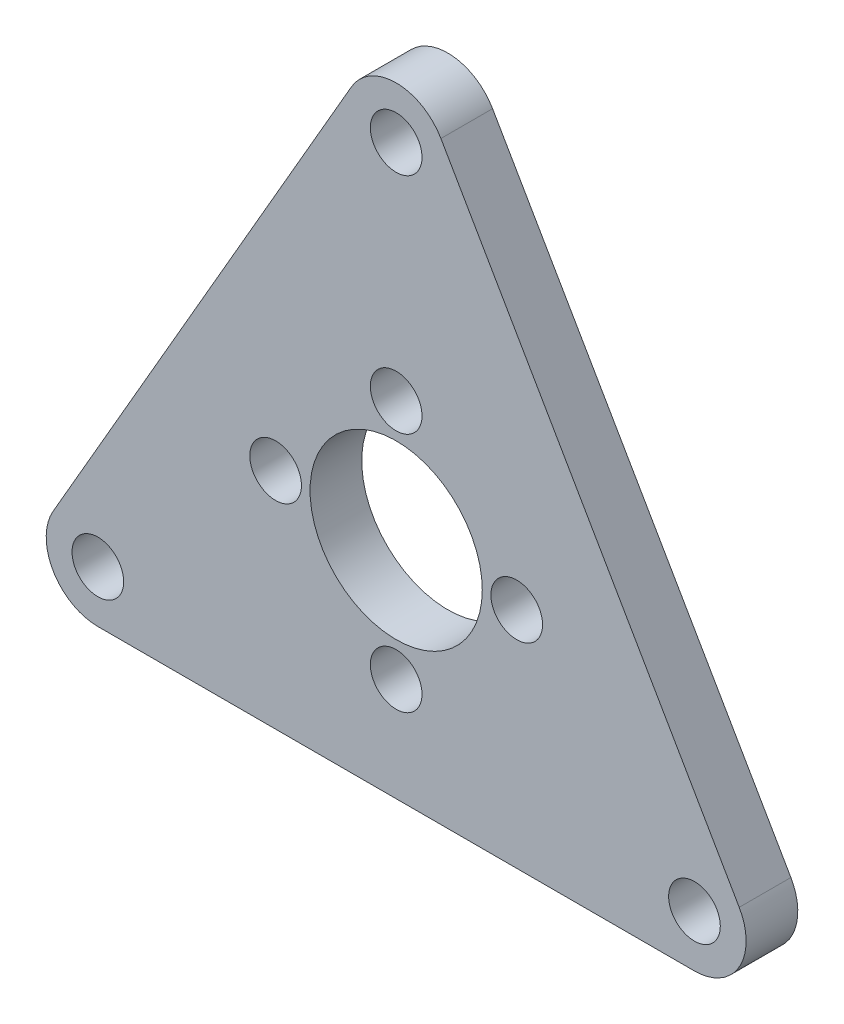
ISO-10303-21;
HEADER;
FILE_DESCRIPTION(('STEP AP214'),'2;1');
FILE_NAME('part.step','',(''),(''),'','','');
FILE_SCHEMA(('AUTOMOTIVE_DESIGN { 1 0 10303 214 1 1 1 1 }'));
ENDSEC;
DATA;
#1=APPLICATION_CONTEXT('core data for automotive mechanical design processes');
#2=APPLICATION_PROTOCOL_DEFINITION('international standard','automotive_design',2000,#1);
#3=PRODUCT_CONTEXT('',#1,'mechanical');
#4=PRODUCT('Part','Part','',(#3));
#5=PRODUCT_RELATED_PRODUCT_CATEGORY('part','',(#4));
#6=PRODUCT_DEFINITION_FORMATION('','',#4);
#7=PRODUCT_DEFINITION_CONTEXT('part definition',#1,'design');
#8=PRODUCT_DEFINITION('design','',#6,#7);
#9=PRODUCT_DEFINITION_SHAPE('','',#8);
#10=(LENGTH_UNIT() NAMED_UNIT(*) SI_UNIT(.MILLI.,.METRE.));
#11=(NAMED_UNIT(*) PLANE_ANGLE_UNIT() SI_UNIT($,.RADIAN.));
#12=(NAMED_UNIT(*) SI_UNIT($,.STERADIAN.) SOLID_ANGLE_UNIT());
#13=UNCERTAINTY_MEASURE_WITH_UNIT(LENGTH_MEASURE(1.E-05),#10,'distance_accuracy_value','');
#14=(GEOMETRIC_REPRESENTATION_CONTEXT(3) GLOBAL_UNCERTAINTY_ASSIGNED_CONTEXT((#13)) GLOBAL_UNIT_ASSIGNED_CONTEXT((#10,
#11,#12)) REPRESENTATION_CONTEXT('',''));
#15=CARTESIAN_POINT('',(0.,0.,0.));
#16=DIRECTION('',(0.,0.,1.));
#17=DIRECTION('',(1.,0.,0.));
#18=AXIS2_PLACEMENT_3D('',#15,#16,#17);
#19=CARTESIAN_POINT('',(-17.3205080756888,-9.99999999999999,3.));
#20=DIRECTION('',(0.,0.,1.));
#21=DIRECTION('',(1.,0.,0.));
#22=AXIS2_PLACEMENT_3D('',#19,#20,#21);
#23=PLANE('',#22);
#24=CARTESIAN_POINT('',(7.,0.,3.));
#25=DIRECTION('',(0.,0.,1.));
#26=DIRECTION('',(1.,0.,0.));
#27=AXIS2_PLACEMENT_3D('',#24,#25,#26);
#28=CIRCLE('',#27,1.5);
#29=CARTESIAN_POINT('',(8.5,0.,3.));
#30=VERTEX_POINT('',#29);
#31=EDGE_CURVE('E217',#30,#30,#28,.F.);
#32=ORIENTED_EDGE('',*,*,#31,.T.);
#33=EDGE_LOOP('',(#32));
#34=FACE_BOUND('',#33,.T.);
#35=CARTESIAN_POINT('',(-7.,0.,3.));
#36=DIRECTION('',(0.,0.,1.));
#37=DIRECTION('',(1.,0.,0.));
#38=AXIS2_PLACEMENT_3D('',#35,#36,#37);
#39=CIRCLE('',#38,1.5);
#40=CARTESIAN_POINT('',(-5.5,0.,3.));
#41=VERTEX_POINT('',#40);
#42=EDGE_CURVE('E222',#41,#41,#39,.F.);
#43=ORIENTED_EDGE('',*,*,#42,.T.);
#44=EDGE_LOOP('',(#43));
#45=FACE_BOUND('',#44,.T.);
#46=CARTESIAN_POINT('',(0.,7.,3.));
#47=DIRECTION('',(0.,0.,1.));
#48=DIRECTION('',(1.,0.,0.));
#49=AXIS2_PLACEMENT_3D('',#46,#47,#48);
#50=CIRCLE('',#49,1.5);
#51=CARTESIAN_POINT('',(1.5,7.,3.));
#52=VERTEX_POINT('',#51);
#53=EDGE_CURVE('E243',#52,#52,#50,.T.);
#54=ORIENTED_EDGE('',*,*,#53,.F.);
#55=EDGE_LOOP('',(#54));
#56=FACE_BOUND('',#55,.T.);
#57=CARTESIAN_POINT('',(17.3205080756888,-10.,3.));
#58=DIRECTION('',(0.,0.,1.));
#59=DIRECTION('',(1.,0.,0.));
#60=AXIS2_PLACEMENT_3D('',#57,#58,#59);
#61=CIRCLE('',#60,1.5);
#62=CARTESIAN_POINT('',(18.8205080756888,-10.,3.));
#63=VERTEX_POINT('',#62);
#64=EDGE_CURVE('E259',#63,#63,#61,.T.);
#65=ORIENTED_EDGE('',*,*,#64,.F.);
#66=EDGE_LOOP('',(#65));
#67=FACE_BOUND('',#66,.T.);
#68=CARTESIAN_POINT('',(-17.3205080756888,-10.,3.));
#69=DIRECTION('',(0.,0.,1.));
#70=DIRECTION('',(1.,0.,0.));
#71=AXIS2_PLACEMENT_3D('',#68,#69,#70);
#72=CIRCLE('',#71,1.5);
#73=CARTESIAN_POINT('',(-15.8205080756888,-10.,3.));
#74=VERTEX_POINT('',#73);
#75=EDGE_CURVE('E134',#74,#74,#72,.T.);
#76=ORIENTED_EDGE('',*,*,#75,.F.);
#77=EDGE_LOOP('',(#76));
#78=FACE_BOUND('',#77,.T.);
#79=CARTESIAN_POINT('',(-17.3205080756888,-9.99999999999999,3.));
#80=DIRECTION('',(0.,0.,1.));
#81=DIRECTION('',(1.,0.,0.));
#82=AXIS2_PLACEMENT_3D('',#79,#80,#81);
#83=CIRCLE('',#82,3.);
#84=CARTESIAN_POINT('',(-19.9185842870421,-8.49999999999999,3.));
#85=VERTEX_POINT('',#84);
#86=CARTESIAN_POINT('',(-17.3205080756888,-13.,3.));
#87=VERTEX_POINT('',#86);
#88=EDGE_CURVE('E146',#85,#87,#83,.T.);
#89=ORIENTED_EDGE('',*,*,#88,.T.);
#90=DIRECTION('',(1.,0.,0.));
#91=VECTOR('',#90,1.);
#92=CARTESIAN_POINT('',(-17.3205080756888,-13.,3.));
#93=LINE('',#92,#91);
#94=CARTESIAN_POINT('',(17.3205080756888,-13.,3.));
#95=VERTEX_POINT('',#94);
#96=EDGE_CURVE('E94',#87,#95,#93,.T.);
#97=ORIENTED_EDGE('',*,*,#96,.T.);
#98=CARTESIAN_POINT('',(17.3205080756888,-9.99999999999999,3.));
#99=DIRECTION('',(0.,0.,1.));
#100=DIRECTION('',(1.,0.,0.));
#101=AXIS2_PLACEMENT_3D('',#98,#99,#100);
#102=CIRCLE('',#101,3.);
#103=CARTESIAN_POINT('',(19.9185842870421,-8.49999999999999,3.));
#104=VERTEX_POINT('',#103);
#105=EDGE_CURVE('E107',#95,#104,#102,.T.);
#106=ORIENTED_EDGE('',*,*,#105,.T.);
#107=DIRECTION('',(-0.5,0.866025403784439,0.));
#108=VECTOR('',#107,1.);
#109=CARTESIAN_POINT('',(19.9185842870421,-8.49999999999999,3.));
#110=LINE('',#109,#108);
#111=CARTESIAN_POINT('',(2.59807621135331,21.5,3.));
#112=VERTEX_POINT('',#111);
#113=EDGE_CURVE('E101',#104,#112,#110,.T.);
#114=ORIENTED_EDGE('',*,*,#113,.T.);
#115=CARTESIAN_POINT('',(0.,20.,3.));
#116=DIRECTION('',(0.,0.,1.));
#117=DIRECTION('',(-1.,0.,0.));
#118=AXIS2_PLACEMENT_3D('',#115,#116,#117);
#119=CIRCLE('',#118,3.);
#120=CARTESIAN_POINT('',(-2.59807621135331,21.5,3.));
#121=VERTEX_POINT('',#120);
#122=EDGE_CURVE('E105',#112,#121,#119,.T.);
#123=ORIENTED_EDGE('',*,*,#122,.T.);
#124=DIRECTION('',(-0.5,-0.866025403784439,0.));
#125=VECTOR('',#124,1.);
#126=CARTESIAN_POINT('',(-2.59807621135331,21.5,3.));
#127=LINE('',#126,#125);
#128=EDGE_CURVE('E57',#121,#85,#127,.T.);
#129=ORIENTED_EDGE('',*,*,#128,.T.);
#130=EDGE_LOOP('',(#89,#97,#106,#114,#123,#129));
#131=FACE_BOUND('',#130,.T.);
#132=CARTESIAN_POINT('',(0.,20.,3.));
#133=DIRECTION('',(0.,0.,1.));
#134=DIRECTION('',(1.,0.,0.));
#135=AXIS2_PLACEMENT_3D('',#132,#133,#134);
#136=CIRCLE('',#135,1.5);
#137=CARTESIAN_POINT('',(1.5,20.,3.));
#138=VERTEX_POINT('',#137);
#139=EDGE_CURVE('E267',#138,#138,#136,.T.);
#140=ORIENTED_EDGE('',*,*,#139,.F.);
#141=EDGE_LOOP('',(#140));
#142=FACE_BOUND('',#141,.T.);
#143=CARTESIAN_POINT('',(0.,0.,3.));
#144=DIRECTION('',(0.,0.,1.));
#145=DIRECTION('',(1.,0.,0.));
#146=AXIS2_PLACEMENT_3D('',#143,#144,#145);
#147=CIRCLE('',#146,5.);
#148=CARTESIAN_POINT('',(5.,0.,3.));
#149=VERTEX_POINT('',#148);
#150=EDGE_CURVE('E251',#149,#149,#147,.T.);
#151=ORIENTED_EDGE('',*,*,#150,.F.);
#152=EDGE_LOOP('',(#151));
#153=FACE_BOUND('',#152,.T.);
#154=CARTESIAN_POINT('',(0.,-7.,3.));
#155=DIRECTION('',(0.,0.,1.));
#156=DIRECTION('',(1.,0.,0.));
#157=AXIS2_PLACEMENT_3D('',#154,#155,#156);
#158=CIRCLE('',#157,1.5);
#159=CARTESIAN_POINT('',(1.5,-7.,3.));
#160=VERTEX_POINT('',#159);
#161=EDGE_CURVE('E235',#160,#160,#158,.T.);
#162=ORIENTED_EDGE('',*,*,#161,.F.);
#163=EDGE_LOOP('',(#162));
#164=FACE_BOUND('',#163,.T.);
#165=ADVANCED_FACE('F39',(#34,#45,#56,#67,#78,#131,#142,#153,#164),#23,.T.);
#166=CARTESIAN_POINT('',(-17.3205080756888,-9.99999999999999,0.));
#167=DIRECTION('',(0.,0.,1.));
#168=DIRECTION('',(1.,0.,0.));
#169=AXIS2_PLACEMENT_3D('',#166,#167,#168);
#170=PLANE('',#169);
#171=CARTESIAN_POINT('',(7.,0.,0.));
#172=DIRECTION('',(0.,0.,1.));
#173=DIRECTION('',(1.,0.,0.));
#174=AXIS2_PLACEMENT_3D('',#171,#172,#173);
#175=CIRCLE('',#174,1.5);
#176=CARTESIAN_POINT('',(8.5,0.,0.));
#177=VERTEX_POINT('',#176);
#178=EDGE_CURVE('E220',#177,#177,#175,.T.);
#179=ORIENTED_EDGE('',*,*,#178,.T.);
#180=EDGE_LOOP('',(#179));
#181=FACE_BOUND('',#180,.T.);
#182=CARTESIAN_POINT('',(-7.,0.,0.));
#183=DIRECTION('',(0.,0.,1.));
#184=DIRECTION('',(-1.,0.,0.));
#185=AXIS2_PLACEMENT_3D('',#182,#183,#184);
#186=CIRCLE('',#185,1.5);
#187=CARTESIAN_POINT('',(-8.5,0.,0.));
#188=VERTEX_POINT('',#187);
#189=EDGE_CURVE('E223',#188,#188,#186,.T.);
#190=ORIENTED_EDGE('',*,*,#189,.T.);
#191=EDGE_LOOP('',(#190));
#192=FACE_BOUND('',#191,.T.);
#193=CARTESIAN_POINT('',(-17.3205080756888,-9.99999999999999,0.));
#194=DIRECTION('',(0.,0.,1.));
#195=DIRECTION('',(1.,0.,0.));
#196=AXIS2_PLACEMENT_3D('',#193,#194,#195);
#197=CIRCLE('',#196,3.);
#198=CARTESIAN_POINT('',(-19.9185842870421,-8.49999999999999,0.));
#199=VERTEX_POINT('',#198);
#200=CARTESIAN_POINT('',(-17.3205080756888,-13.,0.));
#201=VERTEX_POINT('',#200);
#202=EDGE_CURVE('E129',#199,#201,#197,.T.);
#203=ORIENTED_EDGE('',*,*,#202,.F.);
#204=DIRECTION('',(-0.5,-0.866025403784439,0.));
#205=VECTOR('',#204,1.);
#206=CARTESIAN_POINT('',(-2.59807621135331,21.5,0.));
#207=LINE('',#206,#205);
#208=CARTESIAN_POINT('',(-2.59807621135331,21.5,0.));
#209=VERTEX_POINT('',#208);
#210=EDGE_CURVE('E86',#209,#199,#207,.T.);
#211=ORIENTED_EDGE('',*,*,#210,.F.);
#212=CARTESIAN_POINT('',(0.,20.,0.));
#213=DIRECTION('',(0.,0.,1.));
#214=DIRECTION('',(-1.,0.,0.));
#215=AXIS2_PLACEMENT_3D('',#212,#213,#214);
#216=CIRCLE('',#215,3.);
#217=CARTESIAN_POINT('',(2.59807621135331,21.5,0.));
#218=VERTEX_POINT('',#217);
#219=EDGE_CURVE('E80',#218,#209,#216,.T.);
#220=ORIENTED_EDGE('',*,*,#219,.F.);
#221=DIRECTION('',(-0.5,0.866025403784439,0.));
#222=VECTOR('',#221,1.);
#223=CARTESIAN_POINT('',(19.9185842870421,-8.49999999999999,0.));
#224=LINE('',#223,#222);
#225=CARTESIAN_POINT('',(19.9185842870421,-8.49999999999999,0.));
#226=VERTEX_POINT('',#225);
#227=EDGE_CURVE('E116',#226,#218,#224,.T.);
#228=ORIENTED_EDGE('',*,*,#227,.F.);
#229=CARTESIAN_POINT('',(17.3205080756888,-9.99999999999999,0.));
#230=DIRECTION('',(0.,0.,1.));
#231=DIRECTION('',(1.,0.,0.));
#232=AXIS2_PLACEMENT_3D('',#229,#230,#231);
#233=CIRCLE('',#232,3.);
#234=CARTESIAN_POINT('',(17.3205080756888,-13.,0.));
#235=VERTEX_POINT('',#234);
#236=EDGE_CURVE('E137',#235,#226,#233,.T.);
#237=ORIENTED_EDGE('',*,*,#236,.F.);
#238=DIRECTION('',(1.,0.,0.));
#239=VECTOR('',#238,1.);
#240=CARTESIAN_POINT('',(-17.3205080756888,-13.,0.));
#241=LINE('',#240,#239);
#242=EDGE_CURVE('E133',#201,#235,#241,.T.);
#243=ORIENTED_EDGE('',*,*,#242,.F.);
#244=EDGE_LOOP('',(#203,#211,#220,#228,#237,#243));
#245=FACE_BOUND('',#244,.T.);
#246=CARTESIAN_POINT('',(-17.3205080756888,-10.,0.));
#247=DIRECTION('',(0.,0.,1.));
#248=DIRECTION('',(1.,0.,0.));
#249=AXIS2_PLACEMENT_3D('',#246,#247,#248);
#250=CIRCLE('',#249,1.5);
#251=CARTESIAN_POINT('',(-15.8205080756888,-10.,0.));
#252=VERTEX_POINT('',#251);
#253=EDGE_CURVE('E271',#252,#252,#250,.T.);
#254=ORIENTED_EDGE('',*,*,#253,.T.);
#255=EDGE_LOOP('',(#254));
#256=FACE_BOUND('',#255,.T.);
#257=CARTESIAN_POINT('',(0.,20.,0.));
#258=DIRECTION('',(0.,0.,1.));
#259=DIRECTION('',(1.,0.,0.));
#260=AXIS2_PLACEMENT_3D('',#257,#258,#259);
#261=CIRCLE('',#260,1.5);
#262=CARTESIAN_POINT('',(1.5,20.,0.));
#263=VERTEX_POINT('',#262);
#264=EDGE_CURVE('E263',#263,#263,#261,.T.);
#265=ORIENTED_EDGE('',*,*,#264,.T.);
#266=EDGE_LOOP('',(#265));
#267=FACE_BOUND('',#266,.T.);
#268=CARTESIAN_POINT('',(17.3205080756888,-10.,0.));
#269=DIRECTION('',(0.,0.,1.));
#270=DIRECTION('',(1.,0.,0.));
#271=AXIS2_PLACEMENT_3D('',#268,#269,#270);
#272=CIRCLE('',#271,1.5);
#273=CARTESIAN_POINT('',(18.8205080756888,-10.,0.));
#274=VERTEX_POINT('',#273);
#275=EDGE_CURVE('E255',#274,#274,#272,.T.);
#276=ORIENTED_EDGE('',*,*,#275,.T.);
#277=EDGE_LOOP('',(#276));
#278=FACE_BOUND('',#277,.T.);
#279=CARTESIAN_POINT('',(0.,0.,0.));
#280=DIRECTION('',(0.,0.,1.));
#281=DIRECTION('',(1.,0.,0.));
#282=AXIS2_PLACEMENT_3D('',#279,#280,#281);
#283=CIRCLE('',#282,5.);
#284=CARTESIAN_POINT('',(5.,0.,0.));
#285=VERTEX_POINT('',#284);
#286=EDGE_CURVE('E247',#285,#285,#283,.T.);
#287=ORIENTED_EDGE('',*,*,#286,.T.);
#288=EDGE_LOOP('',(#287));
#289=FACE_BOUND('',#288,.T.);
#290=CARTESIAN_POINT('',(0.,7.,0.));
#291=DIRECTION('',(0.,0.,1.));
#292=DIRECTION('',(1.,0.,0.));
#293=AXIS2_PLACEMENT_3D('',#290,#291,#292);
#294=CIRCLE('',#293,1.5);
#295=CARTESIAN_POINT('',(1.5,7.,0.));
#296=VERTEX_POINT('',#295);
#297=EDGE_CURVE('E239',#296,#296,#294,.T.);
#298=ORIENTED_EDGE('',*,*,#297,.T.);
#299=EDGE_LOOP('',(#298));
#300=FACE_BOUND('',#299,.T.);
#301=CARTESIAN_POINT('',(0.,-7.,0.));
#302=DIRECTION('',(0.,0.,1.));
#303=DIRECTION('',(1.,0.,0.));
#304=AXIS2_PLACEMENT_3D('',#301,#302,#303);
#305=CIRCLE('',#304,1.5);
#306=CARTESIAN_POINT('',(1.5,-7.,0.));
#307=VERTEX_POINT('',#306);
#308=EDGE_CURVE('E234',#307,#307,#305,.T.);
#309=ORIENTED_EDGE('',*,*,#308,.T.);
#310=EDGE_LOOP('',(#309));
#311=FACE_BOUND('',#310,.T.);
#312=ADVANCED_FACE('F159',(#181,#192,#245,#256,#267,#278,#289,#300,#311),#170,.F.);
#313=CARTESIAN_POINT('',(-17.3205080756888,-9.99999999999999,3.));
#314=DIRECTION('',(0.,0.,-1.));
#315=DIRECTION('',(-1.,0.,0.));
#316=AXIS2_PLACEMENT_3D('',#313,#314,#315);
#317=CYLINDRICAL_SURFACE('',#316,3.);
#318=ORIENTED_EDGE('',*,*,#202,.T.);
#319=DIRECTION('',(0.,0.,-1.));
#320=VECTOR('',#319,1.);
#321=CARTESIAN_POINT('',(-17.3205080756888,-13.,3.));
#322=LINE('',#321,#320);
#323=EDGE_CURVE('E11',#87,#201,#322,.T.);
#324=ORIENTED_EDGE('',*,*,#323,.F.);
#325=ORIENTED_EDGE('',*,*,#88,.F.);
#326=DIRECTION('',(0.,0.,-1.));
#327=VECTOR('',#326,1.);
#328=CARTESIAN_POINT('',(-19.9185842870421,-8.49999999999999,3.));
#329=LINE('',#328,#327);
#330=EDGE_CURVE('E125',#85,#199,#329,.T.);
#331=ORIENTED_EDGE('',*,*,#330,.T.);
#332=EDGE_LOOP('',(#318,#324,#325,#331));
#333=FACE_BOUND('',#332,.T.);
#334=ADVANCED_FACE('F41',(#333),#317,.T.);
#335=CARTESIAN_POINT('',(-17.3205080756888,-13.,3.));
#336=DIRECTION('',(0.,1.,0.));
#337=DIRECTION('',(0.,0.,1.));
#338=AXIS2_PLACEMENT_3D('',#335,#336,#337);
#339=PLANE('',#338);
#340=ORIENTED_EDGE('',*,*,#242,.T.);
#341=DIRECTION('',(0.,0.,-1.));
#342=VECTOR('',#341,1.);
#343=CARTESIAN_POINT('',(17.3205080756888,-13.,3.));
#344=LINE('',#343,#342);
#345=EDGE_CURVE('E49',#95,#235,#344,.T.);
#346=ORIENTED_EDGE('',*,*,#345,.F.);
#347=ORIENTED_EDGE('',*,*,#96,.F.);
#348=ORIENTED_EDGE('',*,*,#323,.T.);
#349=EDGE_LOOP('',(#340,#346,#347,#348));
#350=FACE_BOUND('',#349,.T.);
#351=ADVANCED_FACE('F373',(#350),#339,.F.);
#352=CARTESIAN_POINT('',(17.3205080756888,-9.99999999999999,3.));
#353=DIRECTION('',(0.,0.,-1.));
#354=DIRECTION('',(-1.,0.,0.));
#355=AXIS2_PLACEMENT_3D('',#352,#353,#354);
#356=CYLINDRICAL_SURFACE('',#355,3.);
#357=ORIENTED_EDGE('',*,*,#236,.T.);
#358=DIRECTION('',(0.,0.,-1.));
#359=VECTOR('',#358,1.);
#360=CARTESIAN_POINT('',(19.9185842870421,-8.49999999999999,3.));
#361=LINE('',#360,#359);
#362=EDGE_CURVE('E118',#104,#226,#361,.T.);
#363=ORIENTED_EDGE('',*,*,#362,.F.);
#364=ORIENTED_EDGE('',*,*,#105,.F.);
#365=ORIENTED_EDGE('',*,*,#345,.T.);
#366=EDGE_LOOP('',(#357,#363,#364,#365));
#367=FACE_BOUND('',#366,.T.);
#368=ADVANCED_FACE('F156',(#367),#356,.T.);
#369=CARTESIAN_POINT('',(19.9185842870421,-8.49999999999999,3.));
#370=DIRECTION('',(-0.866025403784439,-0.5,0.));
#371=DIRECTION('',(0.5,-0.866025403784439,0.));
#372=AXIS2_PLACEMENT_3D('',#369,#370,#371);
#373=PLANE('',#372);
#374=ORIENTED_EDGE('',*,*,#227,.T.);
#375=DIRECTION('',(0.,0.,-1.));
#376=VECTOR('',#375,1.);
#377=CARTESIAN_POINT('',(2.59807621135331,21.5,3.));
#378=LINE('',#377,#376);
#379=EDGE_CURVE('E113',#112,#218,#378,.T.);
#380=ORIENTED_EDGE('',*,*,#379,.F.);
#381=ORIENTED_EDGE('',*,*,#113,.F.);
#382=ORIENTED_EDGE('',*,*,#362,.T.);
#383=EDGE_LOOP('',(#374,#380,#381,#382));
#384=FACE_BOUND('',#383,.T.);
#385=ADVANCED_FACE('F114',(#384),#373,.F.);
#386=CARTESIAN_POINT('',(0.,20.,3.));
#387=DIRECTION('',(0.,0.,-1.));
#388=DIRECTION('',(-1.,0.,0.));
#389=AXIS2_PLACEMENT_3D('',#386,#387,#388);
#390=CYLINDRICAL_SURFACE('',#389,3.);
#391=ORIENTED_EDGE('',*,*,#219,.T.);
#392=DIRECTION('',(0.,0.,-1.));
#393=VECTOR('',#392,1.);
#394=CARTESIAN_POINT('',(-2.59807621135331,21.5,3.));
#395=LINE('',#394,#393);
#396=EDGE_CURVE('E119',#121,#209,#395,.T.);
#397=ORIENTED_EDGE('',*,*,#396,.F.);
#398=ORIENTED_EDGE('',*,*,#122,.F.);
#399=ORIENTED_EDGE('',*,*,#379,.T.);
#400=EDGE_LOOP('',(#391,#397,#398,#399));
#401=FACE_BOUND('',#400,.T.);
#402=ADVANCED_FACE('F121',(#401),#390,.T.);
#403=CARTESIAN_POINT('',(-2.59807621135331,21.5,3.));
#404=DIRECTION('',(0.866025403784438,-0.5,0.));
#405=DIRECTION('',(0.5,0.866025403784439,0.));
#406=AXIS2_PLACEMENT_3D('',#403,#404,#405);
#407=PLANE('',#406);
#408=ORIENTED_EDGE('',*,*,#210,.T.);
#409=ORIENTED_EDGE('',*,*,#330,.F.);
#410=ORIENTED_EDGE('',*,*,#128,.F.);
#411=ORIENTED_EDGE('',*,*,#396,.T.);
#412=EDGE_LOOP('',(#408,#409,#410,#411));
#413=FACE_BOUND('',#412,.T.);
#414=ADVANCED_FACE('F164',(#413),#407,.F.);
#415=CARTESIAN_POINT('',(-17.3205080756888,-10.,3.));
#416=DIRECTION('',(0.,0.,-1.));
#417=DIRECTION('',(-1.,0.,0.));
#418=AXIS2_PLACEMENT_3D('',#415,#416,#417);
#419=CYLINDRICAL_SURFACE('',#418,1.5);
#420=ORIENTED_EDGE('',*,*,#75,.T.);
#421=EDGE_LOOP('',(#420));
#422=FACE_BOUND('',#421,.T.);
#423=ORIENTED_EDGE('',*,*,#253,.F.);
#424=EDGE_LOOP('',(#423));
#425=FACE_BOUND('',#424,.T.);
#426=ADVANCED_FACE('F166',(#422,#425),#419,.F.);
#427=CARTESIAN_POINT('',(0.,20.,3.));
#428=DIRECTION('',(0.,0.,-1.));
#429=DIRECTION('',(-1.,0.,0.));
#430=AXIS2_PLACEMENT_3D('',#427,#428,#429);
#431=CYLINDRICAL_SURFACE('',#430,1.5);
#432=ORIENTED_EDGE('',*,*,#139,.T.);
#433=EDGE_LOOP('',(#432));
#434=FACE_BOUND('',#433,.T.);
#435=ORIENTED_EDGE('',*,*,#264,.F.);
#436=EDGE_LOOP('',(#435));
#437=FACE_BOUND('',#436,.T.);
#438=ADVANCED_FACE('F172',(#434,#437),#431,.F.);
#439=CARTESIAN_POINT('',(17.3205080756888,-10.,3.));
#440=DIRECTION('',(0.,0.,-1.));
#441=DIRECTION('',(-1.,0.,0.));
#442=AXIS2_PLACEMENT_3D('',#439,#440,#441);
#443=CYLINDRICAL_SURFACE('',#442,1.5);
#444=ORIENTED_EDGE('',*,*,#64,.T.);
#445=EDGE_LOOP('',(#444));
#446=FACE_BOUND('',#445,.T.);
#447=ORIENTED_EDGE('',*,*,#275,.F.);
#448=EDGE_LOOP('',(#447));
#449=FACE_BOUND('',#448,.T.);
#450=ADVANCED_FACE('F189',(#446,#449),#443,.F.);
#451=CARTESIAN_POINT('',(0.,0.,3.));
#452=DIRECTION('',(0.,0.,-1.));
#453=DIRECTION('',(-1.,0.,0.));
#454=AXIS2_PLACEMENT_3D('',#451,#452,#453);
#455=CYLINDRICAL_SURFACE('',#454,5.);
#456=ORIENTED_EDGE('',*,*,#150,.T.);
#457=EDGE_LOOP('',(#456));
#458=FACE_BOUND('',#457,.T.);
#459=ORIENTED_EDGE('',*,*,#286,.F.);
#460=EDGE_LOOP('',(#459));
#461=FACE_BOUND('',#460,.T.);
#462=ADVANCED_FACE('F193',(#458,#461),#455,.F.);
#463=CARTESIAN_POINT('',(0.,7.,3.));
#464=DIRECTION('',(0.,0.,-1.));
#465=DIRECTION('',(-1.,0.,0.));
#466=AXIS2_PLACEMENT_3D('',#463,#464,#465);
#467=CYLINDRICAL_SURFACE('',#466,1.5);
#468=ORIENTED_EDGE('',*,*,#53,.T.);
#469=EDGE_LOOP('',(#468));
#470=FACE_BOUND('',#469,.T.);
#471=ORIENTED_EDGE('',*,*,#297,.F.);
#472=EDGE_LOOP('',(#471));
#473=FACE_BOUND('',#472,.T.);
#474=ADVANCED_FACE('F197',(#470,#473),#467,.F.);
#475=CARTESIAN_POINT('',(0.,-7.,3.));
#476=DIRECTION('',(0.,0.,-1.));
#477=DIRECTION('',(-1.,0.,0.));
#478=AXIS2_PLACEMENT_3D('',#475,#476,#477);
#479=CYLINDRICAL_SURFACE('',#478,1.5);
#480=ORIENTED_EDGE('',*,*,#161,.T.);
#481=EDGE_LOOP('',(#480));
#482=FACE_BOUND('',#481,.T.);
#483=ORIENTED_EDGE('',*,*,#308,.F.);
#484=EDGE_LOOP('',(#483));
#485=FACE_BOUND('',#484,.T.);
#486=ADVANCED_FACE('F201',(#482,#485),#479,.F.);
#487=CARTESIAN_POINT('',(-7.,0.,10.));
#488=DIRECTION('',(0.,0.,-1.));
#489=DIRECTION('',(-1.,0.,0.));
#490=AXIS2_PLACEMENT_3D('',#487,#488,#489);
#491=CYLINDRICAL_SURFACE('',#490,1.5);
#492=ORIENTED_EDGE('',*,*,#42,.F.);
#493=EDGE_LOOP('',(#492));
#494=FACE_BOUND('',#493,.T.);
#495=ORIENTED_EDGE('',*,*,#189,.F.);
#496=EDGE_LOOP('',(#495));
#497=FACE_BOUND('',#496,.T.);
#498=ADVANCED_FACE('F205',(#494,#497),#491,.F.);
#499=CARTESIAN_POINT('',(7.,0.,10.));
#500=DIRECTION('',(0.,0.,-1.));
#501=DIRECTION('',(-1.,0.,0.));
#502=AXIS2_PLACEMENT_3D('',#499,#500,#501);
#503=CYLINDRICAL_SURFACE('',#502,1.5);
#504=ORIENTED_EDGE('',*,*,#31,.F.);
#505=EDGE_LOOP('',(#504));
#506=FACE_BOUND('',#505,.T.);
#507=ORIENTED_EDGE('',*,*,#178,.F.);
#508=EDGE_LOOP('',(#507));
#509=FACE_BOUND('',#508,.T.);
#510=ADVANCED_FACE('F209',(#506,#509),#503,.F.);
#511=CLOSED_SHELL('',(#165,#312,#334,#351,#368,#385,#402,#414,#426,#438,#450,#462,#474,#486,
#498,#510));
#512=MANIFOLD_SOLID_BREP('B2',#511);
#513=ADVANCED_BREP_SHAPE_REPRESENTATION('',(#18,#512),#14);
#514=SHAPE_DEFINITION_REPRESENTATION(#9,#513);
ENDSEC;
END-ISO-10303-21;
